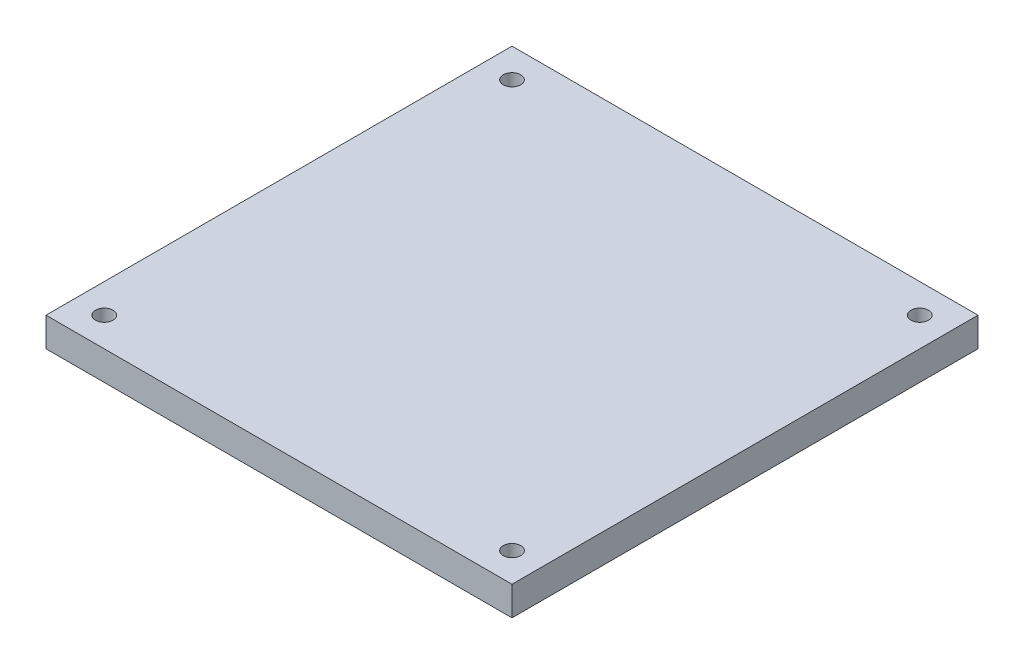
ISO-10303-21;
HEADER;
FILE_DESCRIPTION(('STEP AP214'),'2;1');
FILE_NAME('part.step','',(''),(''),'','','');
FILE_SCHEMA(('AUTOMOTIVE_DESIGN { 1 0 10303 214 1 1 1 1 }'));
ENDSEC;
DATA;
#1=APPLICATION_CONTEXT('core data for automotive mechanical design processes');
#2=APPLICATION_PROTOCOL_DEFINITION('international standard','automotive_design',2000,#1);
#3=PRODUCT_CONTEXT('',#1,'mechanical');
#4=PRODUCT('Part','Part','',(#3));
#5=PRODUCT_RELATED_PRODUCT_CATEGORY('part','',(#4));
#6=PRODUCT_DEFINITION_FORMATION('','',#4);
#7=PRODUCT_DEFINITION_CONTEXT('part definition',#1,'design');
#8=PRODUCT_DEFINITION('design','',#6,#7);
#9=PRODUCT_DEFINITION_SHAPE('','',#8);
#10=(LENGTH_UNIT() NAMED_UNIT(*) SI_UNIT(.MILLI.,.METRE.));
#11=(NAMED_UNIT(*) PLANE_ANGLE_UNIT() SI_UNIT($,.RADIAN.));
#12=(NAMED_UNIT(*) SI_UNIT($,.STERADIAN.) SOLID_ANGLE_UNIT());
#13=UNCERTAINTY_MEASURE_WITH_UNIT(LENGTH_MEASURE(1.E-05),#10,'distance_accuracy_value','');
#14=(GEOMETRIC_REPRESENTATION_CONTEXT(3) GLOBAL_UNCERTAINTY_ASSIGNED_CONTEXT((#13)) GLOBAL_UNIT_ASSIGNED_CONTEXT((#10,
#11,#12)) REPRESENTATION_CONTEXT('',''));
#15=CARTESIAN_POINT('',(0.,0.,0.));
#16=DIRECTION('',(0.,0.,1.));
#17=DIRECTION('',(1.,0.,0.));
#18=AXIS2_PLACEMENT_3D('',#15,#16,#17);
#19=CARTESIAN_POINT('',(-40.,5.,-40.));
#20=DIRECTION('',(1.,0.,0.));
#21=DIRECTION('',(0.,0.,-1.));
#22=AXIS2_PLACEMENT_3D('',#19,#20,#21);
#23=PLANE('',#22);
#24=DIRECTION('',(0.,0.,1.));
#25=VECTOR('',#24,1.);
#26=CARTESIAN_POINT('',(-40.,0.,-40.));
#27=LINE('',#26,#25);
#28=CARTESIAN_POINT('',(-40.,0.,-40.));
#29=VERTEX_POINT('',#28);
#30=CARTESIAN_POINT('',(-40.,0.,40.));
#31=VERTEX_POINT('',#30);
#32=EDGE_CURVE('E98',#29,#31,#27,.T.);
#33=ORIENTED_EDGE('',*,*,#32,.T.);
#34=DIRECTION('',(0.,-1.,0.));
#35=VECTOR('',#34,1.);
#36=CARTESIAN_POINT('',(-40.,5.,40.));
#37=LINE('',#36,#35);
#38=CARTESIAN_POINT('',(-40.,5.,40.));
#39=VERTEX_POINT('',#38);
#40=EDGE_CURVE('E11',#39,#31,#37,.T.);
#41=ORIENTED_EDGE('',*,*,#40,.F.);
#42=DIRECTION('',(0.,0.,1.));
#43=VECTOR('',#42,1.);
#44=CARTESIAN_POINT('',(-40.,5.,-40.));
#45=LINE('',#44,#43);
#46=CARTESIAN_POINT('',(-40.,5.,-40.));
#47=VERTEX_POINT('',#46);
#48=EDGE_CURVE('E86',#47,#39,#45,.T.);
#49=ORIENTED_EDGE('',*,*,#48,.F.);
#50=DIRECTION('',(0.,-1.,0.));
#51=VECTOR('',#50,1.);
#52=CARTESIAN_POINT('',(-40.,5.,-40.));
#53=LINE('',#52,#51);
#54=EDGE_CURVE('E94',#47,#29,#53,.T.);
#55=ORIENTED_EDGE('',*,*,#54,.T.);
#56=EDGE_LOOP('',(#33,#41,#49,#55));
#57=FACE_BOUND('',#56,.T.);
#58=ADVANCED_FACE('F35',(#57),#23,.F.);
#59=CARTESIAN_POINT('',(-40.,5.,40.));
#60=DIRECTION('',(0.,0.,-1.));
#61=DIRECTION('',(-1.,0.,0.));
#62=AXIS2_PLACEMENT_3D('',#59,#60,#61);
#63=PLANE('',#62);
#64=DIRECTION('',(1.,0.,0.));
#65=VECTOR('',#64,1.);
#66=CARTESIAN_POINT('',(-40.,0.,40.));
#67=LINE('',#66,#65);
#68=CARTESIAN_POINT('',(40.,0.,40.));
#69=VERTEX_POINT('',#68);
#70=EDGE_CURVE('E90',#31,#69,#67,.T.);
#71=ORIENTED_EDGE('',*,*,#70,.T.);
#72=DIRECTION('',(0.,-1.,0.));
#73=VECTOR('',#72,1.);
#74=CARTESIAN_POINT('',(40.,5.,40.));
#75=LINE('',#74,#73);
#76=CARTESIAN_POINT('',(40.,5.,40.));
#77=VERTEX_POINT('',#76);
#78=EDGE_CURVE('E43',#77,#69,#75,.T.);
#79=ORIENTED_EDGE('',*,*,#78,.F.);
#80=DIRECTION('',(1.,0.,0.));
#81=VECTOR('',#80,1.);
#82=CARTESIAN_POINT('',(-40.,5.,40.));
#83=LINE('',#82,#81);
#84=EDGE_CURVE('E81',#39,#77,#83,.T.);
#85=ORIENTED_EDGE('',*,*,#84,.F.);
#86=ORIENTED_EDGE('',*,*,#40,.T.);
#87=EDGE_LOOP('',(#71,#79,#85,#86));
#88=FACE_BOUND('',#87,.T.);
#89=ADVANCED_FACE('F89',(#88),#63,.F.);
#90=CARTESIAN_POINT('',(40.,5.,-40.));
#91=DIRECTION('',(-1.,0.,0.));
#92=DIRECTION('',(0.,0.,1.));
#93=AXIS2_PLACEMENT_3D('',#90,#91,#92);
#94=PLANE('',#93);
#95=DIRECTION('',(0.,0.,-1.));
#96=VECTOR('',#95,1.);
#97=CARTESIAN_POINT('',(40.,0.,-40.));
#98=LINE('',#97,#96);
#99=CARTESIAN_POINT('',(40.,0.,-40.));
#100=VERTEX_POINT('',#99);
#101=EDGE_CURVE('E68',#69,#100,#98,.T.);
#102=ORIENTED_EDGE('',*,*,#101,.T.);
#103=DIRECTION('',(0.,-1.,0.));
#104=VECTOR('',#103,1.);
#105=CARTESIAN_POINT('',(40.,5.,-40.));
#106=LINE('',#105,#104);
#107=CARTESIAN_POINT('',(40.,5.,-40.));
#108=VERTEX_POINT('',#107);
#109=EDGE_CURVE('E91',#108,#100,#106,.T.);
#110=ORIENTED_EDGE('',*,*,#109,.F.);
#111=DIRECTION('',(0.,0.,-1.));
#112=VECTOR('',#111,1.);
#113=CARTESIAN_POINT('',(40.,5.,-40.));
#114=LINE('',#113,#112);
#115=EDGE_CURVE('E84',#77,#108,#114,.T.);
#116=ORIENTED_EDGE('',*,*,#115,.F.);
#117=ORIENTED_EDGE('',*,*,#78,.T.);
#118=EDGE_LOOP('',(#102,#110,#116,#117));
#119=FACE_BOUND('',#118,.T.);
#120=ADVANCED_FACE('F92',(#119),#94,.F.);
#121=CARTESIAN_POINT('',(-40.,5.,-40.));
#122=DIRECTION('',(0.,0.,1.));
#123=DIRECTION('',(1.,0.,0.));
#124=AXIS2_PLACEMENT_3D('',#121,#122,#123);
#125=PLANE('',#124);
#126=DIRECTION('',(-1.,0.,0.));
#127=VECTOR('',#126,1.);
#128=CARTESIAN_POINT('',(-40.,0.,-40.));
#129=LINE('',#128,#127);
#130=EDGE_CURVE('E74',#100,#29,#129,.T.);
#131=ORIENTED_EDGE('',*,*,#130,.T.);
#132=ORIENTED_EDGE('',*,*,#54,.F.);
#133=DIRECTION('',(-1.,0.,0.));
#134=VECTOR('',#133,1.);
#135=CARTESIAN_POINT('',(-40.,5.,-40.));
#136=LINE('',#135,#134);
#137=EDGE_CURVE('E51',#108,#47,#136,.T.);
#138=ORIENTED_EDGE('',*,*,#137,.F.);
#139=ORIENTED_EDGE('',*,*,#109,.T.);
#140=EDGE_LOOP('',(#131,#132,#138,#139));
#141=FACE_BOUND('',#140,.T.);
#142=ADVANCED_FACE('F106',(#141),#125,.F.);
#143=CARTESIAN_POINT('',(0.,5.,0.));
#144=DIRECTION('',(0.,1.,0.));
#145=DIRECTION('',(0.,0.,1.));
#146=AXIS2_PLACEMENT_3D('',#143,#144,#145);
#147=PLANE('',#146);
#148=CARTESIAN_POINT('',(35.,5.,-35.));
#149=DIRECTION('',(0.,1.,0.));
#150=DIRECTION('',(0.,0.,1.));
#151=AXIS2_PLACEMENT_3D('',#148,#149,#150);
#152=CIRCLE('',#151,1.5);
#153=CARTESIAN_POINT('',(35.,5.,-33.5));
#154=VERTEX_POINT('',#153);
#155=EDGE_CURVE('E130',#154,#154,#152,.T.);
#156=ORIENTED_EDGE('',*,*,#155,.F.);
#157=EDGE_LOOP('',(#156));
#158=FACE_BOUND('',#157,.T.);
#159=CARTESIAN_POINT('',(-35.,5.,35.));
#160=DIRECTION('',(0.,1.,0.));
#161=DIRECTION('',(0.,0.,1.));
#162=AXIS2_PLACEMENT_3D('',#159,#160,#161);
#163=CIRCLE('',#162,1.5);
#164=CARTESIAN_POINT('',(-35.,5.,36.5));
#165=VERTEX_POINT('',#164);
#166=EDGE_CURVE('E124',#165,#165,#163,.T.);
#167=ORIENTED_EDGE('',*,*,#166,.F.);
#168=EDGE_LOOP('',(#167));
#169=FACE_BOUND('',#168,.T.);
#170=CARTESIAN_POINT('',(35.,5.,35.));
#171=DIRECTION('',(0.,1.,0.));
#172=DIRECTION('',(0.,0.,1.));
#173=AXIS2_PLACEMENT_3D('',#170,#171,#172);
#174=CIRCLE('',#173,1.5);
#175=CARTESIAN_POINT('',(35.,5.,36.5));
#176=VERTEX_POINT('',#175);
#177=EDGE_CURVE('E118',#176,#176,#174,.T.);
#178=ORIENTED_EDGE('',*,*,#177,.F.);
#179=EDGE_LOOP('',(#178));
#180=FACE_BOUND('',#179,.T.);
#181=CARTESIAN_POINT('',(-35.,5.,-35.));
#182=DIRECTION('',(0.,1.,0.));
#183=DIRECTION('',(0.,0.,1.));
#184=AXIS2_PLACEMENT_3D('',#181,#182,#183);
#185=CIRCLE('',#184,1.5);
#186=CARTESIAN_POINT('',(-35.,5.,-33.5));
#187=VERTEX_POINT('',#186);
#188=EDGE_CURVE('E112',#187,#187,#185,.T.);
#189=ORIENTED_EDGE('',*,*,#188,.F.);
#190=EDGE_LOOP('',(#189));
#191=FACE_BOUND('',#190,.T.);
#192=ORIENTED_EDGE('',*,*,#48,.T.);
#193=ORIENTED_EDGE('',*,*,#84,.T.);
#194=ORIENTED_EDGE('',*,*,#115,.T.);
#195=ORIENTED_EDGE('',*,*,#137,.T.);
#196=EDGE_LOOP('',(#192,#193,#194,#195));
#197=FACE_BOUND('',#196,.T.);
#198=ADVANCED_FACE('F82',(#158,#169,#180,#191,#197),#147,.T.);
#199=CARTESIAN_POINT('',(0.,0.,0.));
#200=DIRECTION('',(0.,1.,0.));
#201=DIRECTION('',(0.,0.,1.));
#202=AXIS2_PLACEMENT_3D('',#199,#200,#201);
#203=PLANE('',#202);
#204=CARTESIAN_POINT('',(35.,0.,-35.));
#205=DIRECTION('',(0.,1.,0.));
#206=DIRECTION('',(0.,0.,1.));
#207=AXIS2_PLACEMENT_3D('',#204,#205,#206);
#208=CIRCLE('',#207,1.5);
#209=CARTESIAN_POINT('',(35.,0.,-33.5));
#210=VERTEX_POINT('',#209);
#211=EDGE_CURVE('E127',#210,#210,#208,.T.);
#212=ORIENTED_EDGE('',*,*,#211,.T.);
#213=EDGE_LOOP('',(#212));
#214=FACE_BOUND('',#213,.T.);
#215=CARTESIAN_POINT('',(-35.,0.,35.));
#216=DIRECTION('',(0.,1.,0.));
#217=DIRECTION('',(0.,0.,1.));
#218=AXIS2_PLACEMENT_3D('',#215,#216,#217);
#219=CIRCLE('',#218,1.5);
#220=CARTESIAN_POINT('',(-35.,0.,36.5));
#221=VERTEX_POINT('',#220);
#222=EDGE_CURVE('E121',#221,#221,#219,.T.);
#223=ORIENTED_EDGE('',*,*,#222,.T.);
#224=EDGE_LOOP('',(#223));
#225=FACE_BOUND('',#224,.T.);
#226=CARTESIAN_POINT('',(35.,0.,35.));
#227=DIRECTION('',(0.,1.,0.));
#228=DIRECTION('',(0.,0.,1.));
#229=AXIS2_PLACEMENT_3D('',#226,#227,#228);
#230=CIRCLE('',#229,1.5);
#231=CARTESIAN_POINT('',(35.,0.,36.5));
#232=VERTEX_POINT('',#231);
#233=EDGE_CURVE('E115',#232,#232,#230,.T.);
#234=ORIENTED_EDGE('',*,*,#233,.T.);
#235=EDGE_LOOP('',(#234));
#236=FACE_BOUND('',#235,.T.);
#237=CARTESIAN_POINT('',(-35.,0.,-35.));
#238=DIRECTION('',(0.,1.,0.));
#239=DIRECTION('',(0.,0.,1.));
#240=AXIS2_PLACEMENT_3D('',#237,#238,#239);
#241=CIRCLE('',#240,1.5);
#242=CARTESIAN_POINT('',(-35.,0.,-33.5));
#243=VERTEX_POINT('',#242);
#244=EDGE_CURVE('E101',#243,#243,#241,.T.);
#245=ORIENTED_EDGE('',*,*,#244,.T.);
#246=EDGE_LOOP('',(#245));
#247=FACE_BOUND('',#246,.T.);
#248=ORIENTED_EDGE('',*,*,#32,.F.);
#249=ORIENTED_EDGE('',*,*,#130,.F.);
#250=ORIENTED_EDGE('',*,*,#101,.F.);
#251=ORIENTED_EDGE('',*,*,#70,.F.);
#252=EDGE_LOOP('',(#248,#249,#250,#251));
#253=FACE_BOUND('',#252,.T.);
#254=ADVANCED_FACE('F109',(#214,#225,#236,#247,#253),#203,.F.);
#255=CARTESIAN_POINT('',(-35.,0.,-35.));
#256=DIRECTION('',(0.,1.,0.));
#257=DIRECTION('',(0.,0.,1.));
#258=AXIS2_PLACEMENT_3D('',#255,#256,#257);
#259=CYLINDRICAL_SURFACE('',#258,1.5);
#260=ORIENTED_EDGE('',*,*,#244,.F.);
#261=EDGE_LOOP('',(#260));
#262=FACE_BOUND('',#261,.T.);
#263=ORIENTED_EDGE('',*,*,#188,.T.);
#264=EDGE_LOOP('',(#263));
#265=FACE_BOUND('',#264,.T.);
#266=ADVANCED_FACE('F154',(#262,#265),#259,.F.);
#267=CARTESIAN_POINT('',(35.,0.,35.));
#268=DIRECTION('',(0.,1.,0.));
#269=DIRECTION('',(0.,0.,1.));
#270=AXIS2_PLACEMENT_3D('',#267,#268,#269);
#271=CYLINDRICAL_SURFACE('',#270,1.5);
#272=ORIENTED_EDGE('',*,*,#233,.F.);
#273=EDGE_LOOP('',(#272));
#274=FACE_BOUND('',#273,.T.);
#275=ORIENTED_EDGE('',*,*,#177,.T.);
#276=EDGE_LOOP('',(#275));
#277=FACE_BOUND('',#276,.T.);
#278=ADVANCED_FACE('F156',(#274,#277),#271,.F.);
#279=CARTESIAN_POINT('',(-35.,0.,35.));
#280=DIRECTION('',(0.,1.,0.));
#281=DIRECTION('',(0.,0.,1.));
#282=AXIS2_PLACEMENT_3D('',#279,#280,#281);
#283=CYLINDRICAL_SURFACE('',#282,1.5);
#284=ORIENTED_EDGE('',*,*,#222,.F.);
#285=EDGE_LOOP('',(#284));
#286=FACE_BOUND('',#285,.T.);
#287=ORIENTED_EDGE('',*,*,#166,.T.);
#288=EDGE_LOOP('',(#287));
#289=FACE_BOUND('',#288,.T.);
#290=ADVANCED_FACE('F141',(#286,#289),#283,.F.);
#291=CARTESIAN_POINT('',(35.,0.,-35.));
#292=DIRECTION('',(0.,1.,0.));
#293=DIRECTION('',(0.,0.,1.));
#294=AXIS2_PLACEMENT_3D('',#291,#292,#293);
#295=CYLINDRICAL_SURFACE('',#294,1.5);
#296=ORIENTED_EDGE('',*,*,#211,.F.);
#297=EDGE_LOOP('',(#296));
#298=FACE_BOUND('',#297,.T.);
#299=ORIENTED_EDGE('',*,*,#155,.T.);
#300=EDGE_LOOP('',(#299));
#301=FACE_BOUND('',#300,.T.);
#302=ADVANCED_FACE('F138',(#298,#301),#295,.F.);
#303=CLOSED_SHELL('',(#58,#89,#120,#142,#198,#254,#266,#278,#290,#302));
#304=MANIFOLD_SOLID_BREP('B2',#303);
#305=ADVANCED_BREP_SHAPE_REPRESENTATION('',(#18,#304),#14);
#306=SHAPE_DEFINITION_REPRESENTATION(#9,#305);
ENDSEC;
END-ISO-10303-21;
